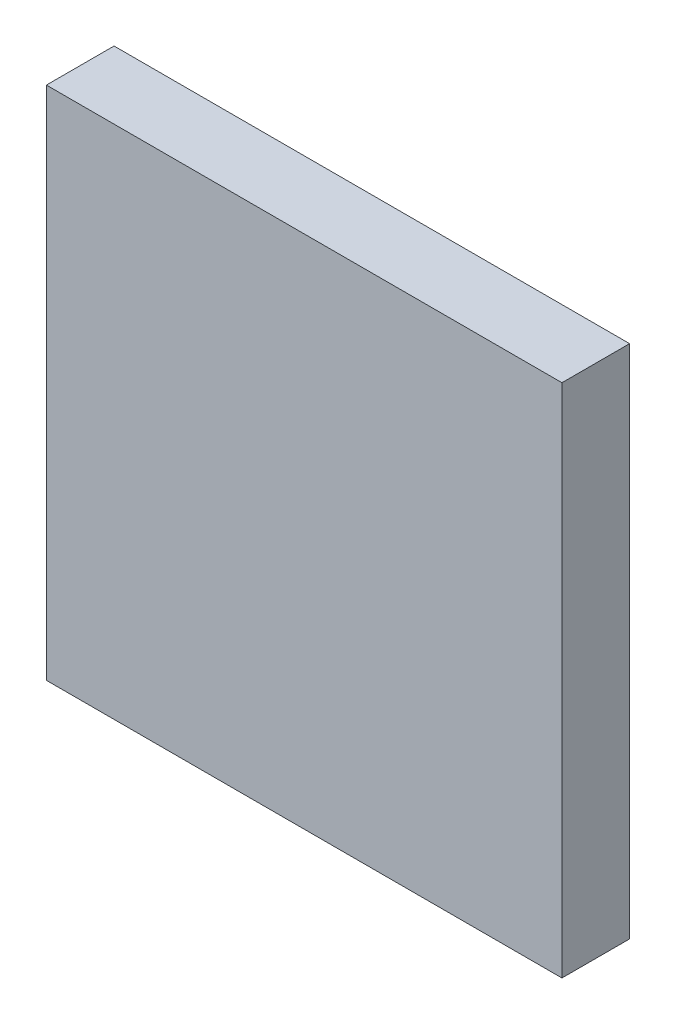
ISO-10303-21;
HEADER;
FILE_DESCRIPTION(('STEP AP214'),'2;1');
FILE_NAME('part.step','',(''),(''),'','','');
FILE_SCHEMA(('AUTOMOTIVE_DESIGN { 1 0 10303 214 1 1 1 1 }'));
ENDSEC;
DATA;
#1=APPLICATION_CONTEXT('core data for automotive mechanical design processes');
#2=APPLICATION_PROTOCOL_DEFINITION('international standard','automotive_design',2000,#1);
#3=PRODUCT_CONTEXT('',#1,'mechanical');
#4=PRODUCT('Part','Part','',(#3));
#5=PRODUCT_RELATED_PRODUCT_CATEGORY('part','',(#4));
#6=PRODUCT_DEFINITION_FORMATION('','',#4);
#7=PRODUCT_DEFINITION_CONTEXT('part definition',#1,'design');
#8=PRODUCT_DEFINITION('design','',#6,#7);
#9=PRODUCT_DEFINITION_SHAPE('','',#8);
#10=(LENGTH_UNIT() NAMED_UNIT(*) SI_UNIT(.MILLI.,.METRE.));
#11=(NAMED_UNIT(*) PLANE_ANGLE_UNIT() SI_UNIT($,.RADIAN.));
#12=(NAMED_UNIT(*) SI_UNIT($,.STERADIAN.) SOLID_ANGLE_UNIT());
#13=UNCERTAINTY_MEASURE_WITH_UNIT(LENGTH_MEASURE(1.E-05),#10,'distance_accuracy_value','');
#14=(GEOMETRIC_REPRESENTATION_CONTEXT(3) GLOBAL_UNCERTAINTY_ASSIGNED_CONTEXT((#13)) GLOBAL_UNIT_ASSIGNED_CONTEXT((#10,
#11,#12)) REPRESENTATION_CONTEXT('',''));
#15=CARTESIAN_POINT('',(0.,0.,0.));
#16=DIRECTION('',(0.,0.,1.));
#17=DIRECTION('',(1.,0.,0.));
#18=AXIS2_PLACEMENT_3D('',#15,#16,#17);
#19=CARTESIAN_POINT('',(0.381,0.381,0.));
#20=DIRECTION('',(0.,1.,0.));
#21=DIRECTION('',(0.,0.,1.));
#22=AXIS2_PLACEMENT_3D('',#19,#20,#21);
#23=PLANE('',#22);
#24=DIRECTION('',(-1.,0.,0.));
#25=VECTOR('',#24,1.);
#26=CARTESIAN_POINT('',(0.381,0.381,0.));
#27=LINE('',#26,#25);
#28=CARTESIAN_POINT('',(0.381,0.381,0.));
#29=VERTEX_POINT('',#28);
#30=CARTESIAN_POINT('',(-0.381,0.381,0.));
#31=VERTEX_POINT('',#30);
#32=EDGE_CURVE('P0_E11',#29,#31,#27,.T.);
#33=ORIENTED_EDGE('',*,*,#32,.T.);
#34=DIRECTION('',(0.,0.,1.));
#35=VECTOR('',#34,1.);
#36=CARTESIAN_POINT('',(-0.381,0.381,0.));
#37=LINE('',#36,#35);
#38=CARTESIAN_POINT('',(-0.381,0.381,0.1));
#39=VERTEX_POINT('',#38);
#40=EDGE_CURVE('P0_E27',#31,#39,#37,.T.);
#41=ORIENTED_EDGE('',*,*,#40,.T.);
#42=DIRECTION('',(-1.,0.,0.));
#43=VECTOR('',#42,1.);
#44=CARTESIAN_POINT('',(0.381,0.381,0.1));
#45=LINE('',#44,#43);
#46=CARTESIAN_POINT('',(0.381,0.381,0.1));
#47=VERTEX_POINT('',#46);
#48=EDGE_CURVE('P0_E72',#47,#39,#45,.T.);
#49=ORIENTED_EDGE('',*,*,#48,.F.);
#50=DIRECTION('',(0.,0.,1.));
#51=VECTOR('',#50,1.);
#52=CARTESIAN_POINT('',(0.381,0.381,0.));
#53=LINE('',#52,#51);
#54=EDGE_CURVE('P0_E81',#29,#47,#53,.T.);
#55=ORIENTED_EDGE('',*,*,#54,.F.);
#56=EDGE_LOOP('',(#33,#41,#49,#55));
#57=FACE_BOUND('',#56,.T.);
#58=ADVANCED_FACE('P0_F17',(#57),#23,.T.);
#59=CARTESIAN_POINT('',(0.381,-0.381,0.));
#60=DIRECTION('',(1.,0.,0.));
#61=DIRECTION('',(0.,0.,-1.));
#62=AXIS2_PLACEMENT_3D('',#59,#60,#61);
#63=PLANE('',#62);
#64=DIRECTION('',(0.,1.,0.));
#65=VECTOR('',#64,1.);
#66=CARTESIAN_POINT('',(0.381,-0.381,0.));
#67=LINE('',#66,#65);
#68=CARTESIAN_POINT('',(0.381,-0.381,0.));
#69=VERTEX_POINT('',#68);
#70=EDGE_CURVE('P0_E78',#69,#29,#67,.T.);
#71=ORIENTED_EDGE('',*,*,#70,.T.);
#72=ORIENTED_EDGE('',*,*,#54,.T.);
#73=DIRECTION('',(0.,1.,0.));
#74=VECTOR('',#73,1.);
#75=CARTESIAN_POINT('',(0.381,-0.381,0.1));
#76=LINE('',#75,#74);
#77=CARTESIAN_POINT('',(0.381,-0.381,0.1));
#78=VERTEX_POINT('',#77);
#79=EDGE_CURVE('P0_E65',#78,#47,#76,.T.);
#80=ORIENTED_EDGE('',*,*,#79,.F.);
#81=DIRECTION('',(0.,0.,1.));
#82=VECTOR('',#81,1.);
#83=CARTESIAN_POINT('',(0.381,-0.381,0.));
#84=LINE('',#83,#82);
#85=EDGE_CURVE('P0_E61',#69,#78,#84,.T.);
#86=ORIENTED_EDGE('',*,*,#85,.F.);
#87=EDGE_LOOP('',(#71,#72,#80,#86));
#88=FACE_BOUND('',#87,.T.);
#89=ADVANCED_FACE('P0_F91',(#88),#63,.T.);
#90=CARTESIAN_POINT('',(-0.381,-0.381,0.));
#91=DIRECTION('',(0.,-1.,0.));
#92=DIRECTION('',(0.,0.,-1.));
#93=AXIS2_PLACEMENT_3D('',#90,#91,#92);
#94=PLANE('',#93);
#95=DIRECTION('',(1.,0.,0.));
#96=VECTOR('',#95,1.);
#97=CARTESIAN_POINT('',(-0.381,-0.381,0.));
#98=LINE('',#97,#96);
#99=CARTESIAN_POINT('',(-0.381,-0.381,0.));
#100=VERTEX_POINT('',#99);
#101=EDGE_CURVE('P0_E84',#100,#69,#98,.T.);
#102=ORIENTED_EDGE('',*,*,#101,.T.);
#103=ORIENTED_EDGE('',*,*,#85,.T.);
#104=DIRECTION('',(1.,0.,0.));
#105=VECTOR('',#104,1.);
#106=CARTESIAN_POINT('',(-0.381,-0.381,0.1));
#107=LINE('',#106,#105);
#108=CARTESIAN_POINT('',(-0.381,-0.381,0.1));
#109=VERTEX_POINT('',#108);
#110=EDGE_CURVE('P0_E59',#109,#78,#107,.T.);
#111=ORIENTED_EDGE('',*,*,#110,.F.);
#112=DIRECTION('',(0.,0.,1.));
#113=VECTOR('',#112,1.);
#114=CARTESIAN_POINT('',(-0.381,-0.381,0.));
#115=LINE('',#114,#113);
#116=EDGE_CURVE('P0_E55',#100,#109,#115,.T.);
#117=ORIENTED_EDGE('',*,*,#116,.F.);
#118=EDGE_LOOP('',(#102,#103,#111,#117));
#119=FACE_BOUND('',#118,.T.);
#120=ADVANCED_FACE('P0_F60',(#119),#94,.T.);
#121=CARTESIAN_POINT('',(-0.381,0.381,0.));
#122=DIRECTION('',(-1.,0.,0.));
#123=DIRECTION('',(0.,0.,1.));
#124=AXIS2_PLACEMENT_3D('',#121,#122,#123);
#125=PLANE('',#124);
#126=DIRECTION('',(0.,-1.,0.));
#127=VECTOR('',#126,1.);
#128=CARTESIAN_POINT('',(-0.381,0.381,0.));
#129=LINE('',#128,#127);
#130=EDGE_CURVE('P0_E69',#31,#100,#129,.T.);
#131=ORIENTED_EDGE('',*,*,#130,.T.);
#132=ORIENTED_EDGE('',*,*,#116,.T.);
#133=DIRECTION('',(0.,-1.,0.));
#134=VECTOR('',#133,1.);
#135=CARTESIAN_POINT('',(-0.381,0.381,0.1));
#136=LINE('',#135,#134);
#137=EDGE_CURVE('P0_E21',#39,#109,#136,.T.);
#138=ORIENTED_EDGE('',*,*,#137,.F.);
#139=ORIENTED_EDGE('',*,*,#40,.F.);
#140=EDGE_LOOP('',(#131,#132,#138,#139));
#141=FACE_BOUND('',#140,.T.);
#142=ADVANCED_FACE('P0_F67',(#141),#125,.T.);
#143=CARTESIAN_POINT('',(0.,0.,0.1));
#144=DIRECTION('',(0.,0.,1.));
#145=DIRECTION('',(1.,0.,0.));
#146=AXIS2_PLACEMENT_3D('',#143,#144,#145);
#147=PLANE('',#146);
#148=ORIENTED_EDGE('',*,*,#137,.T.);
#149=ORIENTED_EDGE('',*,*,#110,.T.);
#150=ORIENTED_EDGE('',*,*,#79,.T.);
#151=ORIENTED_EDGE('',*,*,#48,.T.);
#152=EDGE_LOOP('',(#148,#149,#150,#151));
#153=FACE_BOUND('',#152,.T.);
#154=ADVANCED_FACE('P0_F71',(#153),#147,.T.);
#155=CARTESIAN_POINT('',(0.,0.,0.));
#156=DIRECTION('',(0.,0.,1.));
#157=DIRECTION('',(1.,0.,0.));
#158=AXIS2_PLACEMENT_3D('',#155,#156,#157);
#159=PLANE('',#158);
#160=ORIENTED_EDGE('',*,*,#130,.F.);
#161=ORIENTED_EDGE('',*,*,#32,.F.);
#162=ORIENTED_EDGE('',*,*,#70,.F.);
#163=ORIENTED_EDGE('',*,*,#101,.F.);
#164=EDGE_LOOP('',(#160,#161,#162,#163));
#165=FACE_BOUND('',#164,.T.);
#166=ADVANCED_FACE('P0_F19',(#165),#159,.F.);
#167=CLOSED_SHELL('',(#58,#89,#120,#142,#154,#166));
#168=MANIFOLD_SOLID_BREP('P0_B1',#167);
#169=CARTESIAN_POINT('',(0.,0.,0.));
#170=DIRECTION('',(0.,0.,-1.));
#171=DIRECTION('',(-1.,0.,0.));
#172=AXIS2_PLACEMENT_3D('',#169,#170,#171);
#173=PLANE('',#172);
#174=DIRECTION('',(0.,1.,0.));
#175=VECTOR('',#174,1.);
#176=CARTESIAN_POINT('',(0.381,-0.381,0.));
#177=LINE('',#176,#175);
#178=CARTESIAN_POINT('',(0.381,-0.381,0.));
#179=VERTEX_POINT('',#178);
#180=CARTESIAN_POINT('',(0.381,0.381,0.));
#181=VERTEX_POINT('',#180);
#182=EDGE_CURVE('P1_E54',#179,#181,#177,.T.);
#183=ORIENTED_EDGE('',*,*,#182,.F.);
#184=DIRECTION('',(1.,0.,0.));
#185=VECTOR('',#184,1.);
#186=CARTESIAN_POINT('',(-0.381,-0.381,0.));
#187=LINE('',#186,#185);
#188=CARTESIAN_POINT('',(-0.381,-0.381,0.));
#189=VERTEX_POINT('',#188);
#190=EDGE_CURVE('P1_E56',#189,#179,#187,.T.);
#191=ORIENTED_EDGE('',*,*,#190,.F.);
#192=DIRECTION('',(0.,1.,0.));
#193=VECTOR('',#192,1.);
#194=CARTESIAN_POINT('',(-0.381,0.381,0.));
#195=LINE('',#194,#193);
#196=CARTESIAN_POINT('',(-0.381,0.381,0.));
#197=VERTEX_POINT('',#196);
#198=EDGE_CURVE('P1_E19',#197,#189,#195,.F.);
#199=ORIENTED_EDGE('',*,*,#198,.F.);
#200=DIRECTION('',(1.,0.,0.));
#201=VECTOR('',#200,1.);
#202=CARTESIAN_POINT('',(0.381,0.381,0.));
#203=LINE('',#202,#201);
#204=EDGE_CURVE('P1_E78',#181,#197,#203,.F.);
#205=ORIENTED_EDGE('',*,*,#204,.F.);
#206=EDGE_LOOP('',(#183,#191,#199,#205));
#207=FACE_BOUND('',#206,.T.);
#208=ADVANCED_FACE('P1_F16',(#207),#173,.T.);
#209=CARTESIAN_POINT('',(-0.381,0.381,0.));
#210=DIRECTION('',(-1.,0.,0.));
#211=DIRECTION('',(0.,0.,1.));
#212=AXIS2_PLACEMENT_3D('',#209,#210,#211);
#213=PLANE('',#212);
#214=DIRECTION('',(0.,1.,0.));
#215=VECTOR('',#214,1.);
#216=CARTESIAN_POINT('',(-0.381,0.,0.1));
#217=LINE('',#216,#215);
#218=CARTESIAN_POINT('',(-0.381,0.381,0.1));
#219=VERTEX_POINT('',#218);
#220=CARTESIAN_POINT('',(-0.381,-0.381,0.1));
#221=VERTEX_POINT('',#220);
#222=EDGE_CURVE('P1_E82',#219,#221,#217,.F.);
#223=ORIENTED_EDGE('',*,*,#222,.F.);
#224=DIRECTION('',(0.,0.,1.));
#225=VECTOR('',#224,1.);
#226=CARTESIAN_POINT('',(-0.381,0.381,0.));
#227=LINE('',#226,#225);
#228=EDGE_CURVE('P1_E67',#197,#219,#227,.T.);
#229=ORIENTED_EDGE('',*,*,#228,.F.);
#230=ORIENTED_EDGE('',*,*,#198,.T.);
#231=DIRECTION('',(0.,0.,-1.));
#232=VECTOR('',#231,1.);
#233=CARTESIAN_POINT('',(-0.381,-0.381,0.));
#234=LINE('',#233,#232);
#235=EDGE_CURVE('P1_E62',#221,#189,#234,.T.);
#236=ORIENTED_EDGE('',*,*,#235,.F.);
#237=EDGE_LOOP('',(#223,#229,#230,#236));
#238=FACE_BOUND('',#237,.T.);
#239=ADVANCED_FACE('P1_F64',(#238),#213,.T.);
#240=CARTESIAN_POINT('',(-0.381,-0.381,0.));
#241=DIRECTION('',(0.,-1.,0.));
#242=DIRECTION('',(0.,0.,-1.));
#243=AXIS2_PLACEMENT_3D('',#240,#241,#242);
#244=PLANE('',#243);
#245=DIRECTION('',(1.,0.,0.));
#246=VECTOR('',#245,1.);
#247=CARTESIAN_POINT('',(0.,-0.381,0.1));
#248=LINE('',#247,#246);
#249=CARTESIAN_POINT('',(0.381,-0.381,0.1));
#250=VERTEX_POINT('',#249);
#251=EDGE_CURVE('P1_E71',#221,#250,#248,.T.);
#252=ORIENTED_EDGE('',*,*,#251,.F.);
#253=ORIENTED_EDGE('',*,*,#235,.T.);
#254=ORIENTED_EDGE('',*,*,#190,.T.);
#255=DIRECTION('',(0.,0.,-1.));
#256=VECTOR('',#255,1.);
#257=CARTESIAN_POINT('',(0.381,-0.381,0.));
#258=LINE('',#257,#256);
#259=EDGE_CURVE('P1_E74',#250,#179,#258,.T.);
#260=ORIENTED_EDGE('',*,*,#259,.F.);
#261=EDGE_LOOP('',(#252,#253,#254,#260));
#262=FACE_BOUND('',#261,.T.);
#263=ADVANCED_FACE('P1_F69',(#262),#244,.T.);
#264=CARTESIAN_POINT('',(0.381,-0.381,0.));
#265=DIRECTION('',(1.,0.,0.));
#266=DIRECTION('',(0.,0.,-1.));
#267=AXIS2_PLACEMENT_3D('',#264,#265,#266);
#268=PLANE('',#267);
#269=DIRECTION('',(0.,1.,0.));
#270=VECTOR('',#269,1.);
#271=CARTESIAN_POINT('',(0.381,0.,0.1));
#272=LINE('',#271,#270);
#273=CARTESIAN_POINT('',(0.381,0.381,0.1));
#274=VERTEX_POINT('',#273);
#275=EDGE_CURVE('P1_E25',#250,#274,#272,.T.);
#276=ORIENTED_EDGE('',*,*,#275,.F.);
#277=ORIENTED_EDGE('',*,*,#259,.T.);
#278=ORIENTED_EDGE('',*,*,#182,.T.);
#279=DIRECTION('',(0.,0.,1.));
#280=VECTOR('',#279,1.);
#281=CARTESIAN_POINT('',(0.381,0.381,0.));
#282=LINE('',#281,#280);
#283=EDGE_CURVE('P1_E34',#274,#181,#282,.F.);
#284=ORIENTED_EDGE('',*,*,#283,.F.);
#285=EDGE_LOOP('',(#276,#277,#278,#284));
#286=FACE_BOUND('',#285,.T.);
#287=ADVANCED_FACE('P1_F88',(#286),#268,.T.);
#288=CARTESIAN_POINT('',(0.381,0.381,0.));
#289=DIRECTION('',(0.,1.,0.));
#290=DIRECTION('',(0.,0.,1.));
#291=AXIS2_PLACEMENT_3D('',#288,#289,#290);
#292=PLANE('',#291);
#293=DIRECTION('',(1.,0.,0.));
#294=VECTOR('',#293,1.);
#295=CARTESIAN_POINT('',(0.,0.381,0.1));
#296=LINE('',#295,#294);
#297=EDGE_CURVE('P1_E10',#274,#219,#296,.F.);
#298=ORIENTED_EDGE('',*,*,#297,.F.);
#299=ORIENTED_EDGE('',*,*,#283,.T.);
#300=ORIENTED_EDGE('',*,*,#204,.T.);
#301=ORIENTED_EDGE('',*,*,#228,.T.);
#302=EDGE_LOOP('',(#298,#299,#300,#301));
#303=FACE_BOUND('',#302,.T.);
#304=ADVANCED_FACE('P1_F90',(#303),#292,.T.);
#305=CARTESIAN_POINT('',(0.,0.,0.1));
#306=DIRECTION('',(0.,0.,1.));
#307=DIRECTION('',(1.,0.,0.));
#308=AXIS2_PLACEMENT_3D('',#305,#306,#307);
#309=PLANE('',#308);
#310=ORIENTED_EDGE('',*,*,#275,.T.);
#311=ORIENTED_EDGE('',*,*,#297,.T.);
#312=ORIENTED_EDGE('',*,*,#222,.T.);
#313=ORIENTED_EDGE('',*,*,#251,.T.);
#314=EDGE_LOOP('',(#310,#311,#312,#313));
#315=FACE_BOUND('',#314,.T.);
#316=ADVANCED_FACE('P1_F87',(#315),#309,.T.);
#317=CLOSED_SHELL('',(#208,#239,#263,#287,#304,#316));
#318=MANIFOLD_SOLID_BREP('P1_B1',#317);
#319=ADVANCED_BREP_SHAPE_REPRESENTATION('',(#18,#168,#318),#14);
#320=SHAPE_DEFINITION_REPRESENTATION(#9,#319);
ENDSEC;
END-ISO-10303-21;
